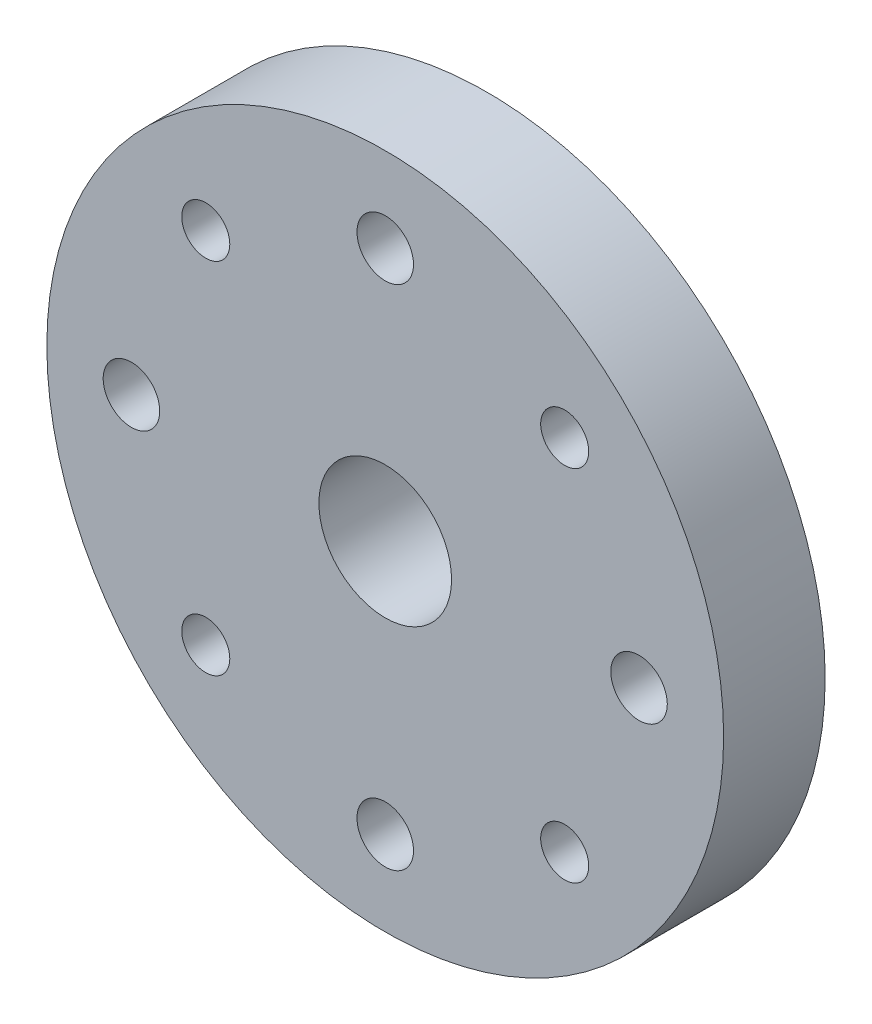
ISO-10303-21;
HEADER;
FILE_DESCRIPTION(('STEP AP214'),'2;1');
FILE_NAME('part.step','',(''),(''),'','','');
FILE_SCHEMA(('AUTOMOTIVE_DESIGN { 1 0 10303 214 1 1 1 1 }'));
ENDSEC;
DATA;
#1=APPLICATION_CONTEXT('core data for automotive mechanical design processes');
#2=APPLICATION_PROTOCOL_DEFINITION('international standard','automotive_design',2000,#1);
#3=PRODUCT_CONTEXT('',#1,'mechanical');
#4=PRODUCT('Part','Part','',(#3));
#5=PRODUCT_RELATED_PRODUCT_CATEGORY('part','',(#4));
#6=PRODUCT_DEFINITION_FORMATION('','',#4);
#7=PRODUCT_DEFINITION_CONTEXT('part definition',#1,'design');
#8=PRODUCT_DEFINITION('design','',#6,#7);
#9=PRODUCT_DEFINITION_SHAPE('','',#8);
#10=(LENGTH_UNIT() NAMED_UNIT(*) SI_UNIT(.MILLI.,.METRE.));
#11=(NAMED_UNIT(*) PLANE_ANGLE_UNIT() SI_UNIT($,.RADIAN.));
#12=(NAMED_UNIT(*) SI_UNIT($,.STERADIAN.) SOLID_ANGLE_UNIT());
#13=UNCERTAINTY_MEASURE_WITH_UNIT(LENGTH_MEASURE(1.E-05),#10,'distance_accuracy_value','');
#14=(GEOMETRIC_REPRESENTATION_CONTEXT(3) GLOBAL_UNCERTAINTY_ASSIGNED_CONTEXT((#13)) GLOBAL_UNIT_ASSIGNED_CONTEXT((#10,
#11,#12)) REPRESENTATION_CONTEXT('',''));
#15=CARTESIAN_POINT('',(0.,0.,0.));
#16=DIRECTION('',(0.,0.,1.));
#17=DIRECTION('',(1.,0.,0.));
#18=AXIS2_PLACEMENT_3D('',#15,#16,#17);
#19=CARTESIAN_POINT('',(0.,0.,6.));
#20=DIRECTION('',(0.,0.,1.));
#21=DIRECTION('',(1.,0.,0.));
#22=AXIS2_PLACEMENT_3D('',#19,#20,#21);
#23=PLANE('',#22);
#24=CARTESIAN_POINT('',(-15.,1.57116660247941E-13,6.));
#25=DIRECTION('',(0.,0.,1.));
#26=DIRECTION('',(1.,0.,0.));
#27=AXIS2_PLACEMENT_3D('',#24,#25,#26);
#28=CIRCLE('',#27,1.67);
#29=CARTESIAN_POINT('',(-13.33,1.57116660247941E-13,6.));
#30=VERTEX_POINT('',#29);
#31=EDGE_CURVE('E60',#30,#30,#28,.T.);
#32=ORIENTED_EDGE('',*,*,#31,.F.);
#33=EDGE_LOOP('',(#32));
#34=FACE_BOUND('',#33,.T.);
#35=CARTESIAN_POINT('',(3.74802517533735E-13,-15.0000000000001,6.));
#36=DIRECTION('',(0.,0.,1.));
#37=DIRECTION('',(1.,0.,0.));
#38=AXIS2_PLACEMENT_3D('',#35,#36,#37);
#39=CIRCLE('',#38,1.67);
#40=CARTESIAN_POINT('',(1.67000000000037,-15.0000000000001,6.));
#41=VERTEX_POINT('',#40);
#42=EDGE_CURVE('E72',#41,#41,#39,.T.);
#43=ORIENTED_EDGE('',*,*,#42,.F.);
#44=EDGE_LOOP('',(#43));
#45=FACE_BOUND('',#44,.T.);
#46=CARTESIAN_POINT('',(15.,0.,6.));
#47=DIRECTION('',(0.,0.,1.));
#48=DIRECTION('',(1.,0.,0.));
#49=AXIS2_PLACEMENT_3D('',#46,#47,#48);
#50=CIRCLE('',#49,1.67);
#51=CARTESIAN_POINT('',(16.67,0.,6.));
#52=VERTEX_POINT('',#51);
#53=EDGE_CURVE('E84',#52,#52,#50,.T.);
#54=ORIENTED_EDGE('',*,*,#53,.F.);
#55=EDGE_LOOP('',(#54));
#56=FACE_BOUND('',#55,.T.);
#57=CARTESIAN_POINT('',(0.,15.,6.));
#58=DIRECTION('',(0.,0.,1.));
#59=DIRECTION('',(1.,0.,0.));
#60=AXIS2_PLACEMENT_3D('',#57,#58,#59);
#61=CIRCLE('',#60,1.67);
#62=CARTESIAN_POINT('',(1.67,15.,6.));
#63=VERTEX_POINT('',#62);
#64=EDGE_CURVE('E52',#63,#63,#61,.T.);
#65=ORIENTED_EDGE('',*,*,#64,.F.);
#66=EDGE_LOOP('',(#65));
#67=FACE_BOUND('',#66,.T.);
#68=CARTESIAN_POINT('',(0.,0.,6.));
#69=DIRECTION('',(0.,0.,1.));
#70=DIRECTION('',(1.,0.,0.));
#71=AXIS2_PLACEMENT_3D('',#68,#69,#70);
#72=CIRCLE('',#71,20.);
#73=CARTESIAN_POINT('',(20.,0.,6.));
#74=VERTEX_POINT('',#73);
#75=EDGE_CURVE('E11',#74,#74,#72,.T.);
#76=ORIENTED_EDGE('',*,*,#75,.T.);
#77=EDGE_LOOP('',(#76));
#78=FACE_BOUND('',#77,.T.);
#79=CARTESIAN_POINT('',(0.,0.,6.));
#80=DIRECTION('',(0.,0.,1.));
#81=DIRECTION('',(1.,0.,0.));
#82=AXIS2_PLACEMENT_3D('',#79,#80,#81);
#83=CIRCLE('',#82,3.92);
#84=CARTESIAN_POINT('',(3.92,0.,6.));
#85=VERTEX_POINT('',#84);
#86=EDGE_CURVE('E44',#85,#85,#83,.T.);
#87=ORIENTED_EDGE('',*,*,#86,.F.);
#88=EDGE_LOOP('',(#87));
#89=FACE_BOUND('',#88,.T.);
#90=CARTESIAN_POINT('',(10.6066017177982,10.6066017177982,6.));
#91=DIRECTION('',(0.,0.,1.));
#92=DIRECTION('',(1.,0.,0.));
#93=AXIS2_PLACEMENT_3D('',#90,#91,#92);
#94=CIRCLE('',#93,1.42);
#95=CARTESIAN_POINT('',(12.0266017177982,10.6066017177982,6.));
#96=VERTEX_POINT('',#95);
#97=EDGE_CURVE('E90',#96,#96,#94,.T.);
#98=ORIENTED_EDGE('',*,*,#97,.F.);
#99=EDGE_LOOP('',(#98));
#100=FACE_BOUND('',#99,.T.);
#101=CARTESIAN_POINT('',(10.6066017177982,-10.6066017177983,6.));
#102=DIRECTION('',(0.,0.,1.));
#103=DIRECTION('',(1.,0.,0.));
#104=AXIS2_PLACEMENT_3D('',#101,#102,#103);
#105=CIRCLE('',#104,1.42);
#106=CARTESIAN_POINT('',(12.0266017177982,-10.6066017177983,6.));
#107=VERTEX_POINT('',#106);
#108=EDGE_CURVE('E78',#107,#107,#105,.T.);
#109=ORIENTED_EDGE('',*,*,#108,.F.);
#110=EDGE_LOOP('',(#109));
#111=FACE_BOUND('',#110,.T.);
#112=CARTESIAN_POINT('',(-10.6066017177979,-10.6066017177983,6.));
#113=DIRECTION('',(0.,0.,1.));
#114=DIRECTION('',(1.,0.,0.));
#115=AXIS2_PLACEMENT_3D('',#112,#113,#114);
#116=CIRCLE('',#115,1.42);
#117=CARTESIAN_POINT('',(-9.18660171779785,-10.6066017177983,6.));
#118=VERTEX_POINT('',#117);
#119=EDGE_CURVE('E66',#118,#118,#116,.T.);
#120=ORIENTED_EDGE('',*,*,#119,.F.);
#121=EDGE_LOOP('',(#120));
#122=FACE_BOUND('',#121,.T.);
#123=CARTESIAN_POINT('',(-10.6066017177981,10.6066017177983,6.));
#124=DIRECTION('',(0.,0.,1.));
#125=DIRECTION('',(1.,0.,0.));
#126=AXIS2_PLACEMENT_3D('',#123,#124,#125);
#127=CIRCLE('',#126,1.42);
#128=CARTESIAN_POINT('',(-9.18660171779808,10.6066017177983,6.));
#129=VERTEX_POINT('',#128);
#130=EDGE_CURVE('E53',#129,#129,#127,.T.);
#131=ORIENTED_EDGE('',*,*,#130,.F.);
#132=EDGE_LOOP('',(#131));
#133=FACE_BOUND('',#132,.T.);
#134=ADVANCED_FACE('F31',(#34,#45,#56,#67,#78,#89,#100,#111,#122,#133),#23,.T.);
#135=CARTESIAN_POINT('',(0.,0.,0.));
#136=DIRECTION('',(0.,0.,1.));
#137=DIRECTION('',(1.,0.,0.));
#138=AXIS2_PLACEMENT_3D('',#135,#136,#137);
#139=PLANE('',#138);
#140=CARTESIAN_POINT('',(-15.,1.57116660247941E-13,0.));
#141=DIRECTION('',(0.,0.,1.));
#142=DIRECTION('',(1.,0.,0.));
#143=AXIS2_PLACEMENT_3D('',#140,#141,#142);
#144=CIRCLE('',#143,1.67);
#145=CARTESIAN_POINT('',(-13.33,1.57116660247941E-13,0.));
#146=VERTEX_POINT('',#145);
#147=EDGE_CURVE('E56',#146,#146,#144,.T.);
#148=ORIENTED_EDGE('',*,*,#147,.T.);
#149=EDGE_LOOP('',(#148));
#150=FACE_BOUND('',#149,.T.);
#151=CARTESIAN_POINT('',(3.74802517533735E-13,-15.0000000000001,0.));
#152=DIRECTION('',(0.,0.,1.));
#153=DIRECTION('',(1.,0.,0.));
#154=AXIS2_PLACEMENT_3D('',#151,#152,#153);
#155=CIRCLE('',#154,1.67);
#156=CARTESIAN_POINT('',(1.67000000000037,-15.0000000000001,0.));
#157=VERTEX_POINT('',#156);
#158=EDGE_CURVE('E69',#157,#157,#155,.T.);
#159=ORIENTED_EDGE('',*,*,#158,.T.);
#160=EDGE_LOOP('',(#159));
#161=FACE_BOUND('',#160,.T.);
#162=CARTESIAN_POINT('',(15.,0.,0.));
#163=DIRECTION('',(0.,0.,1.));
#164=DIRECTION('',(1.,0.,0.));
#165=AXIS2_PLACEMENT_3D('',#162,#163,#164);
#166=CIRCLE('',#165,1.67);
#167=CARTESIAN_POINT('',(16.67,0.,0.));
#168=VERTEX_POINT('',#167);
#169=EDGE_CURVE('E81',#168,#168,#166,.T.);
#170=ORIENTED_EDGE('',*,*,#169,.T.);
#171=EDGE_LOOP('',(#170));
#172=FACE_BOUND('',#171,.T.);
#173=CARTESIAN_POINT('',(0.,15.,0.));
#174=DIRECTION('',(0.,0.,1.));
#175=DIRECTION('',(1.,0.,0.));
#176=AXIS2_PLACEMENT_3D('',#173,#174,#175);
#177=CIRCLE('',#176,1.67);
#178=CARTESIAN_POINT('',(1.67,15.,0.));
#179=VERTEX_POINT('',#178);
#180=EDGE_CURVE('E35',#179,#179,#177,.T.);
#181=ORIENTED_EDGE('',*,*,#180,.T.);
#182=EDGE_LOOP('',(#181));
#183=FACE_BOUND('',#182,.T.);
#184=CARTESIAN_POINT('',(0.,0.,0.));
#185=DIRECTION('',(0.,0.,1.));
#186=DIRECTION('',(1.,0.,0.));
#187=AXIS2_PLACEMENT_3D('',#184,#185,#186);
#188=CIRCLE('',#187,20.);
#189=CARTESIAN_POINT('',(20.,0.,0.));
#190=VERTEX_POINT('',#189);
#191=EDGE_CURVE('E39',#190,#190,#188,.T.);
#192=ORIENTED_EDGE('',*,*,#191,.F.);
#193=EDGE_LOOP('',(#192));
#194=FACE_BOUND('',#193,.T.);
#195=CARTESIAN_POINT('',(0.,0.,0.));
#196=DIRECTION('',(0.,0.,1.));
#197=DIRECTION('',(1.,0.,0.));
#198=AXIS2_PLACEMENT_3D('',#195,#196,#197);
#199=CIRCLE('',#198,3.92);
#200=CARTESIAN_POINT('',(3.92,0.,0.));
#201=VERTEX_POINT('',#200);
#202=EDGE_CURVE('E49',#201,#201,#199,.T.);
#203=ORIENTED_EDGE('',*,*,#202,.T.);
#204=EDGE_LOOP('',(#203));
#205=FACE_BOUND('',#204,.T.);
#206=CARTESIAN_POINT('',(10.6066017177982,10.6066017177982,0.));
#207=DIRECTION('',(0.,0.,1.));
#208=DIRECTION('',(1.,0.,0.));
#209=AXIS2_PLACEMENT_3D('',#206,#207,#208);
#210=CIRCLE('',#209,1.42);
#211=CARTESIAN_POINT('',(12.0266017177982,10.6066017177982,0.));
#212=VERTEX_POINT('',#211);
#213=EDGE_CURVE('E87',#212,#212,#210,.T.);
#214=ORIENTED_EDGE('',*,*,#213,.T.);
#215=EDGE_LOOP('',(#214));
#216=FACE_BOUND('',#215,.T.);
#217=CARTESIAN_POINT('',(10.6066017177982,-10.6066017177983,0.));
#218=DIRECTION('',(0.,0.,1.));
#219=DIRECTION('',(1.,0.,0.));
#220=AXIS2_PLACEMENT_3D('',#217,#218,#219);
#221=CIRCLE('',#220,1.42);
#222=CARTESIAN_POINT('',(12.0266017177982,-10.6066017177983,0.));
#223=VERTEX_POINT('',#222);
#224=EDGE_CURVE('E75',#223,#223,#221,.T.);
#225=ORIENTED_EDGE('',*,*,#224,.T.);
#226=EDGE_LOOP('',(#225));
#227=FACE_BOUND('',#226,.T.);
#228=CARTESIAN_POINT('',(-10.6066017177979,-10.6066017177983,0.));
#229=DIRECTION('',(0.,0.,1.));
#230=DIRECTION('',(1.,0.,0.));
#231=AXIS2_PLACEMENT_3D('',#228,#229,#230);
#232=CIRCLE('',#231,1.42);
#233=CARTESIAN_POINT('',(-9.18660171779785,-10.6066017177983,0.));
#234=VERTEX_POINT('',#233);
#235=EDGE_CURVE('E63',#234,#234,#232,.T.);
#236=ORIENTED_EDGE('',*,*,#235,.T.);
#237=EDGE_LOOP('',(#236));
#238=FACE_BOUND('',#237,.T.);
#239=CARTESIAN_POINT('',(-10.6066017177981,10.6066017177983,0.));
#240=DIRECTION('',(0.,0.,1.));
#241=DIRECTION('',(1.,0.,0.));
#242=AXIS2_PLACEMENT_3D('',#239,#240,#241);
#243=CIRCLE('',#242,1.42);
#244=CARTESIAN_POINT('',(-9.18660171779808,10.6066017177983,0.));
#245=VERTEX_POINT('',#244);
#246=EDGE_CURVE('E57',#245,#245,#243,.T.);
#247=ORIENTED_EDGE('',*,*,#246,.T.);
#248=EDGE_LOOP('',(#247));
#249=FACE_BOUND('',#248,.T.);
#250=ADVANCED_FACE('F100',(#150,#161,#172,#183,#194,#205,#216,#227,#238,#249),#139,.F.);
#251=CARTESIAN_POINT('',(0.,0.,6.));
#252=DIRECTION('',(0.,0.,-1.));
#253=DIRECTION('',(-1.,0.,0.));
#254=AXIS2_PLACEMENT_3D('',#251,#252,#253);
#255=CYLINDRICAL_SURFACE('',#254,20.);
#256=ORIENTED_EDGE('',*,*,#75,.F.);
#257=EDGE_LOOP('',(#256));
#258=FACE_BOUND('',#257,.T.);
#259=ORIENTED_EDGE('',*,*,#191,.T.);
#260=EDGE_LOOP('',(#259));
#261=FACE_BOUND('',#260,.T.);
#262=ADVANCED_FACE('F115',(#258,#261),#255,.T.);
#263=CARTESIAN_POINT('',(0.,0.,6.));
#264=DIRECTION('',(0.,0.,-1.));
#265=DIRECTION('',(-1.,0.,0.));
#266=AXIS2_PLACEMENT_3D('',#263,#264,#265);
#267=CYLINDRICAL_SURFACE('',#266,3.92);
#268=ORIENTED_EDGE('',*,*,#86,.T.);
#269=EDGE_LOOP('',(#268));
#270=FACE_BOUND('',#269,.T.);
#271=ORIENTED_EDGE('',*,*,#202,.F.);
#272=EDGE_LOOP('',(#271));
#273=FACE_BOUND('',#272,.T.);
#274=ADVANCED_FACE('F106',(#270,#273),#267,.F.);
#275=CARTESIAN_POINT('',(0.,15.,6.));
#276=DIRECTION('',(0.,0.,-1.));
#277=DIRECTION('',(-1.,0.,0.));
#278=AXIS2_PLACEMENT_3D('',#275,#276,#277);
#279=CYLINDRICAL_SURFACE('',#278,1.67);
#280=ORIENTED_EDGE('',*,*,#64,.T.);
#281=EDGE_LOOP('',(#280));
#282=FACE_BOUND('',#281,.T.);
#283=ORIENTED_EDGE('',*,*,#180,.F.);
#284=EDGE_LOOP('',(#283));
#285=FACE_BOUND('',#284,.T.);
#286=ADVANCED_FACE('F103',(#282,#285),#279,.F.);
#287=CARTESIAN_POINT('',(10.6066017177982,10.6066017177982,6.));
#288=DIRECTION('',(0.,0.,-1.));
#289=DIRECTION('',(-1.,0.,0.));
#290=AXIS2_PLACEMENT_3D('',#287,#288,#289);
#291=CYLINDRICAL_SURFACE('',#290,1.42);
#292=ORIENTED_EDGE('',*,*,#97,.T.);
#293=EDGE_LOOP('',(#292));
#294=FACE_BOUND('',#293,.T.);
#295=ORIENTED_EDGE('',*,*,#213,.F.);
#296=EDGE_LOOP('',(#295));
#297=FACE_BOUND('',#296,.T.);
#298=ADVANCED_FACE('F105',(#294,#297),#291,.F.);
#299=CARTESIAN_POINT('',(15.,0.,6.));
#300=DIRECTION('',(0.,0.,-1.));
#301=DIRECTION('',(-1.,0.,0.));
#302=AXIS2_PLACEMENT_3D('',#299,#300,#301);
#303=CYLINDRICAL_SURFACE('',#302,1.67);
#304=ORIENTED_EDGE('',*,*,#53,.T.);
#305=EDGE_LOOP('',(#304));
#306=FACE_BOUND('',#305,.T.);
#307=ORIENTED_EDGE('',*,*,#169,.F.);
#308=EDGE_LOOP('',(#307));
#309=FACE_BOUND('',#308,.T.);
#310=ADVANCED_FACE('F112',(#306,#309),#303,.F.);
#311=CARTESIAN_POINT('',(10.6066017177982,-10.6066017177983,6.));
#312=DIRECTION('',(0.,0.,-1.));
#313=DIRECTION('',(-1.,0.,0.));
#314=AXIS2_PLACEMENT_3D('',#311,#312,#313);
#315=CYLINDRICAL_SURFACE('',#314,1.42);
#316=ORIENTED_EDGE('',*,*,#108,.T.);
#317=EDGE_LOOP('',(#316));
#318=FACE_BOUND('',#317,.T.);
#319=ORIENTED_EDGE('',*,*,#224,.F.);
#320=EDGE_LOOP('',(#319));
#321=FACE_BOUND('',#320,.T.);
#322=ADVANCED_FACE('F166',(#318,#321),#315,.F.);
#323=CARTESIAN_POINT('',(3.74802517533735E-13,-15.0000000000001,6.));
#324=DIRECTION('',(0.,0.,-1.));
#325=DIRECTION('',(-1.,0.,0.));
#326=AXIS2_PLACEMENT_3D('',#323,#324,#325);
#327=CYLINDRICAL_SURFACE('',#326,1.67);
#328=ORIENTED_EDGE('',*,*,#42,.T.);
#329=EDGE_LOOP('',(#328));
#330=FACE_BOUND('',#329,.T.);
#331=ORIENTED_EDGE('',*,*,#158,.F.);
#332=EDGE_LOOP('',(#331));
#333=FACE_BOUND('',#332,.T.);
#334=ADVANCED_FACE('F159',(#330,#333),#327,.F.);
#335=CARTESIAN_POINT('',(-10.6066017177979,-10.6066017177983,6.));
#336=DIRECTION('',(0.,0.,-1.));
#337=DIRECTION('',(-1.,0.,0.));
#338=AXIS2_PLACEMENT_3D('',#335,#336,#337);
#339=CYLINDRICAL_SURFACE('',#338,1.42);
#340=ORIENTED_EDGE('',*,*,#119,.T.);
#341=EDGE_LOOP('',(#340));
#342=FACE_BOUND('',#341,.T.);
#343=ORIENTED_EDGE('',*,*,#235,.F.);
#344=EDGE_LOOP('',(#343));
#345=FACE_BOUND('',#344,.T.);
#346=ADVANCED_FACE('F152',(#342,#345),#339,.F.);
#347=CARTESIAN_POINT('',(-15.,1.57116660247941E-13,6.));
#348=DIRECTION('',(0.,0.,-1.));
#349=DIRECTION('',(-1.,0.,0.));
#350=AXIS2_PLACEMENT_3D('',#347,#348,#349);
#351=CYLINDRICAL_SURFACE('',#350,1.67);
#352=ORIENTED_EDGE('',*,*,#31,.T.);
#353=EDGE_LOOP('',(#352));
#354=FACE_BOUND('',#353,.T.);
#355=ORIENTED_EDGE('',*,*,#147,.F.);
#356=EDGE_LOOP('',(#355));
#357=FACE_BOUND('',#356,.T.);
#358=ADVANCED_FACE('F147',(#354,#357),#351,.F.);
#359=CARTESIAN_POINT('',(-10.6066017177981,10.6066017177983,6.));
#360=DIRECTION('',(0.,0.,-1.));
#361=DIRECTION('',(-1.,0.,0.));
#362=AXIS2_PLACEMENT_3D('',#359,#360,#361);
#363=CYLINDRICAL_SURFACE('',#362,1.42);
#364=ORIENTED_EDGE('',*,*,#130,.T.);
#365=EDGE_LOOP('',(#364));
#366=FACE_BOUND('',#365,.T.);
#367=ORIENTED_EDGE('',*,*,#246,.F.);
#368=EDGE_LOOP('',(#367));
#369=FACE_BOUND('',#368,.T.);
#370=ADVANCED_FACE('F33',(#366,#369),#363,.F.);
#371=CLOSED_SHELL('',(#134,#250,#262,#274,#286,#298,#310,#322,#334,#346,#358,#370));
#372=MANIFOLD_SOLID_BREP('B2',#371);
#373=ADVANCED_BREP_SHAPE_REPRESENTATION('',(#18,#372),#14);
#374=SHAPE_DEFINITION_REPRESENTATION(#9,#373);
ENDSEC;
END-ISO-10303-21;
